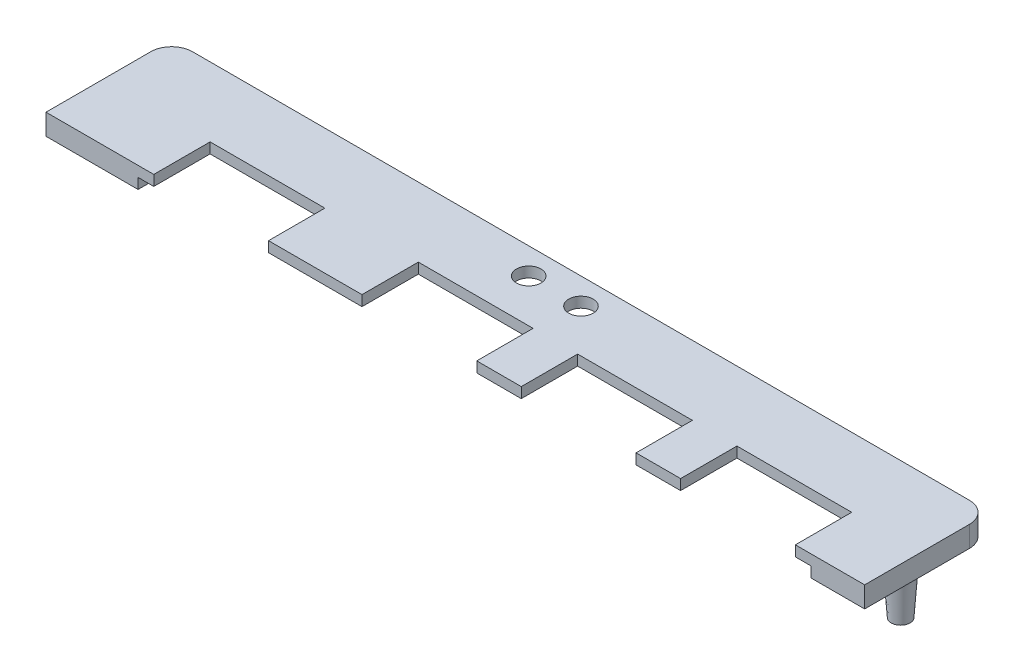
ISO-10303-21;
HEADER;
FILE_DESCRIPTION(('STEP AP214'),'2;1');
FILE_NAME('part.step','',(''),(''),'','','');
FILE_SCHEMA(('AUTOMOTIVE_DESIGN { 1 0 10303 214 1 1 1 1 }'));
ENDSEC;
DATA;
#1=APPLICATION_CONTEXT('core data for automotive mechanical design processes');
#2=APPLICATION_PROTOCOL_DEFINITION('international standard','automotive_design',2000,#1);
#3=PRODUCT_CONTEXT('',#1,'mechanical');
#4=PRODUCT('Part','Part','',(#3));
#5=PRODUCT_RELATED_PRODUCT_CATEGORY('part','',(#4));
#6=PRODUCT_DEFINITION_FORMATION('','',#4);
#7=PRODUCT_DEFINITION_CONTEXT('part definition',#1,'design');
#8=PRODUCT_DEFINITION('design','',#6,#7);
#9=PRODUCT_DEFINITION_SHAPE('','',#8);
#10=(LENGTH_UNIT() NAMED_UNIT(*) SI_UNIT(.MILLI.,.METRE.));
#11=(NAMED_UNIT(*) PLANE_ANGLE_UNIT() SI_UNIT($,.RADIAN.));
#12=(NAMED_UNIT(*) SI_UNIT($,.STERADIAN.) SOLID_ANGLE_UNIT());
#13=UNCERTAINTY_MEASURE_WITH_UNIT(LENGTH_MEASURE(1.E-05),#10,'distance_accuracy_value','');
#14=(GEOMETRIC_REPRESENTATION_CONTEXT(3) GLOBAL_UNCERTAINTY_ASSIGNED_CONTEXT((#13)) GLOBAL_UNIT_ASSIGNED_CONTEXT((#10,
#11,#12)) REPRESENTATION_CONTEXT('',''));
#15=CARTESIAN_POINT('',(0.,0.,0.));
#16=DIRECTION('',(0.,0.,1.));
#17=DIRECTION('',(1.,0.,0.));
#18=AXIS2_PLACEMENT_3D('',#15,#16,#17);
#19=CARTESIAN_POINT('',(0.,1.27,-26.3271000000001));
#20=DIRECTION('',(0.,0.,-1.));
#21=DIRECTION('',(-1.,0.,0.));
#22=AXIS2_PLACEMENT_3D('',#19,#20,#21);
#23=PLANE('',#22);
#24=DIRECTION('',(1.,0.,0.));
#25=VECTOR('',#24,1.);
#26=CARTESIAN_POINT('',(0.,0.,-26.3271000000001));
#27=LINE('',#26,#25);
#28=CARTESIAN_POINT('',(27.3685000000001,0.,-26.3271000000002));
#29=VERTEX_POINT('',#28);
#30=CARTESIAN_POINT('',(41.3131000000001,0.,-26.3271000000002));
#31=VERTEX_POINT('',#30);
#32=EDGE_CURVE('E354',#29,#31,#27,.T.);
#33=ORIENTED_EDGE('',*,*,#32,.T.);
#34=DIRECTION('',(0.,-1.,0.));
#35=VECTOR('',#34,1.);
#36=CARTESIAN_POINT('',(41.3131000000001,1.27,-26.3271000000002));
#37=LINE('',#36,#35);
#38=CARTESIAN_POINT('',(41.3131000000001,1.27,-26.3271000000002));
#39=VERTEX_POINT('',#38);
#40=EDGE_CURVE('E221',#39,#31,#37,.T.);
#41=ORIENTED_EDGE('',*,*,#40,.F.);
#42=DIRECTION('',(1.,0.,0.));
#43=VECTOR('',#42,1.);
#44=CARTESIAN_POINT('',(0.,1.27,-26.3271000000001));
#45=LINE('',#44,#43);
#46=CARTESIAN_POINT('',(27.3685000000001,1.27,-26.3271000000002));
#47=VERTEX_POINT('',#46);
#48=EDGE_CURVE('E317',#47,#39,#45,.T.);
#49=ORIENTED_EDGE('',*,*,#48,.F.);
#50=DIRECTION('',(0.,-1.,0.));
#51=VECTOR('',#50,1.);
#52=CARTESIAN_POINT('',(27.3685000000001,1.27,-26.3271000000002));
#53=LINE('',#52,#51);
#54=EDGE_CURVE('E362',#47,#29,#53,.T.);
#55=ORIENTED_EDGE('',*,*,#54,.T.);
#56=EDGE_LOOP('',(#33,#41,#49,#55));
#57=FACE_BOUND('',#56,.T.);
#58=ADVANCED_FACE('F36',(#57),#23,.F.);
#59=CARTESIAN_POINT('',(0.,1.27,-26.3271000000002));
#60=DIRECTION('',(0.,0.,-1.));
#61=DIRECTION('',(-1.,0.,0.));
#62=AXIS2_PLACEMENT_3D('',#59,#60,#61);
#63=PLANE('',#62);
#64=DIRECTION('',(1.,0.,0.));
#65=VECTOR('',#64,1.);
#66=CARTESIAN_POINT('',(0.,0.,-26.3271000000002));
#67=LINE('',#66,#65);
#68=CARTESIAN_POINT('',(8.01369999999999,0.,-26.3271000000002));
#69=VERTEX_POINT('',#68);
#70=CARTESIAN_POINT('',(21.9583,0.,-26.3271000000002));
#71=VERTEX_POINT('',#70);
#72=EDGE_CURVE('E345',#69,#71,#67,.T.);
#73=ORIENTED_EDGE('',*,*,#72,.T.);
#74=DIRECTION('',(0.,-1.,0.));
#75=VECTOR('',#74,1.);
#76=CARTESIAN_POINT('',(21.9583,1.27,-26.3271000000002));
#77=LINE('',#76,#75);
#78=CARTESIAN_POINT('',(21.9583,1.27,-26.3271000000002));
#79=VERTEX_POINT('',#78);
#80=EDGE_CURVE('E364',#79,#71,#77,.T.);
#81=ORIENTED_EDGE('',*,*,#80,.F.);
#82=DIRECTION('',(1.,0.,0.));
#83=VECTOR('',#82,1.);
#84=CARTESIAN_POINT('',(0.,1.27,-26.3271000000002));
#85=LINE('',#84,#83);
#86=CARTESIAN_POINT('',(8.01369999999999,1.27,-26.3271000000002));
#87=VERTEX_POINT('',#86);
#88=EDGE_CURVE('E308',#87,#79,#85,.T.);
#89=ORIENTED_EDGE('',*,*,#88,.F.);
#90=DIRECTION('',(0.,-1.,0.));
#91=VECTOR('',#90,1.);
#92=CARTESIAN_POINT('',(8.01369999999999,1.27,-26.3271000000002));
#93=LINE('',#92,#91);
#94=EDGE_CURVE('E367',#87,#69,#93,.T.);
#95=ORIENTED_EDGE('',*,*,#94,.T.);
#96=EDGE_LOOP('',(#73,#81,#89,#95));
#97=FACE_BOUND('',#96,.T.);
#98=ADVANCED_FACE('F543',(#97),#63,.F.);
#99=CARTESIAN_POINT('',(0.,1.27,-26.3271000000002));
#100=DIRECTION('',(0.,0.,-1.));
#101=DIRECTION('',(-1.,0.,0.));
#102=AXIS2_PLACEMENT_3D('',#99,#100,#101);
#103=PLANE('',#102);
#104=DIRECTION('',(1.,0.,0.));
#105=VECTOR('',#104,1.);
#106=CARTESIAN_POINT('',(0.,0.,-26.3271000000002));
#107=LINE('',#106,#105);
#108=CARTESIAN_POINT('',(-11.3411,0.,-26.3271000000002));
#109=VERTEX_POINT('',#108);
#110=CARTESIAN_POINT('',(2.6035,0.,-26.3271000000002));
#111=VERTEX_POINT('',#110);
#112=EDGE_CURVE('E336',#109,#111,#107,.T.);
#113=ORIENTED_EDGE('',*,*,#112,.T.);
#114=DIRECTION('',(0.,-1.,0.));
#115=VECTOR('',#114,1.);
#116=CARTESIAN_POINT('',(2.6035,1.27,-26.3271000000002));
#117=LINE('',#116,#115);
#118=CARTESIAN_POINT('',(2.6035,1.27,-26.3271000000002));
#119=VERTEX_POINT('',#118);
#120=EDGE_CURVE('E369',#119,#111,#117,.T.);
#121=ORIENTED_EDGE('',*,*,#120,.F.);
#122=DIRECTION('',(1.,0.,0.));
#123=VECTOR('',#122,1.);
#124=CARTESIAN_POINT('',(0.,1.27,-26.3271000000002));
#125=LINE('',#124,#123);
#126=CARTESIAN_POINT('',(-11.3411,1.27,-26.3271000000002));
#127=VERTEX_POINT('',#126);
#128=EDGE_CURVE('E299',#127,#119,#125,.T.);
#129=ORIENTED_EDGE('',*,*,#128,.F.);
#130=DIRECTION('',(0.,-1.,0.));
#131=VECTOR('',#130,1.);
#132=CARTESIAN_POINT('',(-11.3411,1.27,-26.3271000000002));
#133=LINE('',#132,#131);
#134=EDGE_CURVE('E372',#127,#109,#133,.T.);
#135=ORIENTED_EDGE('',*,*,#134,.T.);
#136=EDGE_LOOP('',(#113,#121,#129,#135));
#137=FACE_BOUND('',#136,.T.);
#138=ADVANCED_FACE('F548',(#137),#103,.F.);
#139=CARTESIAN_POINT('',(0.,1.27,-26.3271000000001));
#140=DIRECTION('',(0.,0.,-1.));
#141=DIRECTION('',(-1.,0.,0.));
#142=AXIS2_PLACEMENT_3D('',#139,#140,#141);
#143=PLANE('',#142);
#144=DIRECTION('',(1.,0.,0.));
#145=VECTOR('',#144,1.);
#146=CARTESIAN_POINT('',(0.,0.,-26.3271000000001));
#147=LINE('',#146,#145);
#148=CARTESIAN_POINT('',(-36.6395000000001,0.,-26.3271000000001));
#149=VERTEX_POINT('',#148);
#150=CARTESIAN_POINT('',(-22.6949000000001,0.,-26.3271000000001));
#151=VERTEX_POINT('',#150);
#152=EDGE_CURVE('E330',#149,#151,#147,.T.);
#153=ORIENTED_EDGE('',*,*,#152,.T.);
#154=DIRECTION('',(0.,-1.,0.));
#155=VECTOR('',#154,1.);
#156=CARTESIAN_POINT('',(-22.6949000000001,1.27,-26.3271000000001));
#157=LINE('',#156,#155);
#158=CARTESIAN_POINT('',(-22.6949000000001,1.27,-26.3271000000001));
#159=VERTEX_POINT('',#158);
#160=EDGE_CURVE('E326',#159,#151,#157,.T.);
#161=ORIENTED_EDGE('',*,*,#160,.F.);
#162=DIRECTION('',(1.,0.,0.));
#163=VECTOR('',#162,1.);
#164=CARTESIAN_POINT('',(0.,1.27,-26.3271000000001));
#165=LINE('',#164,#163);
#166=CARTESIAN_POINT('',(-36.6395000000001,1.27,-26.3271000000001));
#167=VERTEX_POINT('',#166);
#168=EDGE_CURVE('E289',#167,#159,#165,.T.);
#169=ORIENTED_EDGE('',*,*,#168,.F.);
#170=DIRECTION('',(0.,-1.,0.));
#171=VECTOR('',#170,1.);
#172=CARTESIAN_POINT('',(-36.6395000000001,1.27,-26.3271000000001));
#173=LINE('',#172,#171);
#174=EDGE_CURVE('E374',#167,#149,#173,.T.);
#175=ORIENTED_EDGE('',*,*,#174,.T.);
#176=EDGE_LOOP('',(#153,#161,#169,#175));
#177=FACE_BOUND('',#176,.T.);
#178=ADVANCED_FACE('F530',(#177),#143,.F.);
#179=CARTESIAN_POINT('',(0.,1.27,-34.7472));
#180=DIRECTION('',(0.,0.,-1.));
#181=DIRECTION('',(-1.,0.,0.));
#182=AXIS2_PLACEMENT_3D('',#179,#180,#181);
#183=PLANE('',#182);
#184=DIRECTION('',(1.,0.,0.));
#185=VECTOR('',#184,1.);
#186=CARTESIAN_POINT('',(-49.7332,-1.27,-34.7472));
#187=LINE('',#186,#185);
#188=CARTESIAN_POINT('',(-47.1932,-1.27,-34.7472));
#189=VERTEX_POINT('',#188);
#190=CARTESIAN_POINT('',(-38.5445,-1.27,-34.7472));
#191=VERTEX_POINT('',#190);
#192=EDGE_CURVE('E274',#189,#191,#187,.T.);
#193=ORIENTED_EDGE('',*,*,#192,.F.);
#194=DIRECTION('',(0.,-1.,0.));
#195=VECTOR('',#194,1.);
#196=CARTESIAN_POINT('',(-47.1932,1.27,-34.7472));
#197=LINE('',#196,#195);
#198=CARTESIAN_POINT('',(-47.1932,1.27,-34.7472));
#199=VERTEX_POINT('',#198);
#200=EDGE_CURVE('E388',#189,#199,#197,.F.);
#201=ORIENTED_EDGE('',*,*,#200,.T.);
#202=DIRECTION('',(1.,0.,0.));
#203=VECTOR('',#202,1.);
#204=CARTESIAN_POINT('',(0.,1.27,-34.7472));
#205=LINE('',#204,#203);
#206=CARTESIAN_POINT('',(47.1932000000001,1.27,-34.7472));
#207=VERTEX_POINT('',#206);
#208=EDGE_CURVE('E293',#199,#207,#205,.T.);
#209=ORIENTED_EDGE('',*,*,#208,.T.);
#210=DIRECTION('',(0.,-1.,0.));
#211=VECTOR('',#210,1.);
#212=CARTESIAN_POINT('',(47.1932000000001,-1.27,-34.7472));
#213=LINE('',#212,#211);
#214=CARTESIAN_POINT('',(47.1932000000001,-1.27,-34.7472));
#215=VERTEX_POINT('',#214);
#216=EDGE_CURVE('E385',#207,#215,#213,.T.);
#217=ORIENTED_EDGE('',*,*,#216,.T.);
#218=DIRECTION('',(1.,0.,0.));
#219=VECTOR('',#218,1.);
#220=CARTESIAN_POINT('',(43.2181,-1.27,-34.7472));
#221=LINE('',#220,#219);
#222=CARTESIAN_POINT('',(43.2181,-1.27,-34.7472));
#223=VERTEX_POINT('',#222);
#224=EDGE_CURVE('E212',#223,#215,#221,.T.);
#225=ORIENTED_EDGE('',*,*,#224,.F.);
#226=DIRECTION('',(0.,1.,0.));
#227=VECTOR('',#226,1.);
#228=CARTESIAN_POINT('',(43.2181,-1.27,-34.7472));
#229=LINE('',#228,#227);
#230=CARTESIAN_POINT('',(43.2181,0.,-34.7472));
#231=VERTEX_POINT('',#230);
#232=EDGE_CURVE('E211',#223,#231,#229,.T.);
#233=ORIENTED_EDGE('',*,*,#232,.T.);
#234=DIRECTION('',(1.,0.,0.));
#235=VECTOR('',#234,1.);
#236=CARTESIAN_POINT('',(0.,0.,-34.7472));
#237=LINE('',#236,#235);
#238=CARTESIAN_POINT('',(-38.5445,0.,-34.7472));
#239=VERTEX_POINT('',#238);
#240=EDGE_CURVE('E333',#239,#231,#237,.T.);
#241=ORIENTED_EDGE('',*,*,#240,.F.);
#242=DIRECTION('',(0.,1.,0.));
#243=VECTOR('',#242,1.);
#244=CARTESIAN_POINT('',(-38.5445,-1.27,-34.7472));
#245=LINE('',#244,#243);
#246=EDGE_CURVE('E279',#191,#239,#245,.T.);
#247=ORIENTED_EDGE('',*,*,#246,.F.);
#248=EDGE_LOOP('',(#193,#201,#209,#217,#225,#233,#241,#247));
#249=FACE_BOUND('',#248,.T.);
#250=ADVANCED_FACE('F412',(#249),#183,.T.);
#251=CARTESIAN_POINT('',(0.,1.27,0.));
#252=DIRECTION('',(0.,1.,0.));
#253=DIRECTION('',(0.,0.,1.));
#254=AXIS2_PLACEMENT_3D('',#251,#252,#253);
#255=PLANE('',#254);
#256=CARTESIAN_POINT('',(-3.175,1.27,-31.5722000000001));
#257=DIRECTION('',(0.,1.,0.));
#258=DIRECTION('',(0.,0.,1.));
#259=AXIS2_PLACEMENT_3D('',#256,#257,#258);
#260=CIRCLE('',#259,1.4859);
#261=CARTESIAN_POINT('',(-3.175,1.27,-30.0863000000001));
#262=VERTEX_POINT('',#261);
#263=EDGE_CURVE('E454',#262,#262,#260,.T.);
#264=ORIENTED_EDGE('',*,*,#263,.F.);
#265=EDGE_LOOP('',(#264));
#266=FACE_BOUND('',#265,.T.);
#267=CARTESIAN_POINT('',(3.175,1.27,-31.5722000000001));
#268=DIRECTION('',(0.,1.,0.));
#269=DIRECTION('',(0.,0.,1.));
#270=AXIS2_PLACEMENT_3D('',#267,#268,#269);
#271=CIRCLE('',#270,1.4859);
#272=CARTESIAN_POINT('',(3.175,1.27,-30.0863000000001));
#273=VERTEX_POINT('',#272);
#274=EDGE_CURVE('E448',#273,#273,#271,.T.);
#275=ORIENTED_EDGE('',*,*,#274,.F.);
#276=EDGE_LOOP('',(#275));
#277=FACE_BOUND('',#276,.T.);
#278=ORIENTED_EDGE('',*,*,#208,.F.);
#279=CARTESIAN_POINT('',(-47.1932,1.27,-32.2072));
#280=DIRECTION('',(0.,1.,0.));
#281=DIRECTION('',(0.,0.,1.));
#282=AXIS2_PLACEMENT_3D('',#279,#280,#281);
#283=CIRCLE('',#282,2.54);
#284=CARTESIAN_POINT('',(-49.7332,1.27,-32.2072));
#285=VERTEX_POINT('',#284);
#286=EDGE_CURVE('E392',#199,#285,#283,.T.);
#287=ORIENTED_EDGE('',*,*,#286,.T.);
#288=DIRECTION('',(0.,0.,-1.));
#289=VECTOR('',#288,1.);
#290=CARTESIAN_POINT('',(-49.7332,1.27,0.));
#291=LINE('',#290,#289);
#292=CARTESIAN_POINT('',(-49.7332,1.27,-19.4818000000001));
#293=VERTEX_POINT('',#292);
#294=EDGE_CURVE('E296',#293,#285,#291,.T.);
#295=ORIENTED_EDGE('',*,*,#294,.F.);
#296=DIRECTION('',(1.,0.,0.));
#297=VECTOR('',#296,1.);
#298=CARTESIAN_POINT('',(-49.7332,1.27,-19.4818000000001));
#299=LINE('',#298,#297);
#300=CARTESIAN_POINT('',(-36.6395000000001,1.27,-19.4818000000001));
#301=VERTEX_POINT('',#300);
#302=EDGE_CURVE('E230',#293,#301,#299,.T.);
#303=ORIENTED_EDGE('',*,*,#302,.T.);
#304=DIRECTION('',(0.,0.,-1.));
#305=VECTOR('',#304,1.);
#306=CARTESIAN_POINT('',(-36.6395000000001,1.27,0.));
#307=LINE('',#306,#305);
#308=EDGE_CURVE('E286',#301,#167,#307,.T.);
#309=ORIENTED_EDGE('',*,*,#308,.T.);
#310=ORIENTED_EDGE('',*,*,#168,.T.);
#311=DIRECTION('',(0.,0.,-1.));
#312=VECTOR('',#311,1.);
#313=CARTESIAN_POINT('',(-22.6949000000001,1.27,0.));
#314=LINE('',#313,#312);
#315=CARTESIAN_POINT('',(-22.6949000000001,1.27,-19.4818000000001));
#316=VERTEX_POINT('',#315);
#317=EDGE_CURVE('E284',#316,#159,#314,.T.);
#318=ORIENTED_EDGE('',*,*,#317,.F.);
#319=CARTESIAN_POINT('',(-11.3411,1.27,-19.4818000000001));
#320=VERTEX_POINT('',#319);
#321=EDGE_CURVE('E424',#316,#320,#299,.T.);
#322=ORIENTED_EDGE('',*,*,#321,.T.);
#323=DIRECTION('',(0.,0.,1.));
#324=VECTOR('',#323,1.);
#325=CARTESIAN_POINT('',(-11.3411,1.27,0.));
#326=LINE('',#325,#324);
#327=EDGE_CURVE('E305',#127,#320,#326,.T.);
#328=ORIENTED_EDGE('',*,*,#327,.F.);
#329=ORIENTED_EDGE('',*,*,#128,.T.);
#330=DIRECTION('',(0.,0.,1.));
#331=VECTOR('',#330,1.);
#332=CARTESIAN_POINT('',(2.6035,1.27,0.));
#333=LINE('',#332,#331);
#334=CARTESIAN_POINT('',(2.6035,1.27,-19.4818000000001));
#335=VERTEX_POINT('',#334);
#336=EDGE_CURVE('E302',#119,#335,#333,.T.);
#337=ORIENTED_EDGE('',*,*,#336,.T.);
#338=CARTESIAN_POINT('',(8.01370000000001,1.27,-19.4818000000001));
#339=VERTEX_POINT('',#338);
#340=EDGE_CURVE('E427',#335,#339,#299,.T.);
#341=ORIENTED_EDGE('',*,*,#340,.T.);
#342=DIRECTION('',(0.,0.,1.));
#343=VECTOR('',#342,1.);
#344=CARTESIAN_POINT('',(8.01370000000009,1.27,0.));
#345=LINE('',#344,#343);
#346=EDGE_CURVE('E314',#87,#339,#345,.T.);
#347=ORIENTED_EDGE('',*,*,#346,.F.);
#348=ORIENTED_EDGE('',*,*,#88,.T.);
#349=DIRECTION('',(0.,0.,1.));
#350=VECTOR('',#349,1.);
#351=CARTESIAN_POINT('',(21.9583,1.27,0.));
#352=LINE('',#351,#350);
#353=CARTESIAN_POINT('',(21.9583,1.27,-19.4818000000001));
#354=VERTEX_POINT('',#353);
#355=EDGE_CURVE('E311',#79,#354,#352,.T.);
#356=ORIENTED_EDGE('',*,*,#355,.T.);
#357=CARTESIAN_POINT('',(27.3685000000001,1.27,-19.4818000000001));
#358=VERTEX_POINT('',#357);
#359=EDGE_CURVE('E428',#354,#358,#299,.T.);
#360=ORIENTED_EDGE('',*,*,#359,.T.);
#361=DIRECTION('',(0.,0.,1.));
#362=VECTOR('',#361,1.);
#363=CARTESIAN_POINT('',(27.3685000000001,1.27,0.));
#364=LINE('',#363,#362);
#365=EDGE_CURVE('E323',#47,#358,#364,.T.);
#366=ORIENTED_EDGE('',*,*,#365,.F.);
#367=ORIENTED_EDGE('',*,*,#48,.T.);
#368=DIRECTION('',(0.,0.,1.));
#369=VECTOR('',#368,1.);
#370=CARTESIAN_POINT('',(41.3131,1.27,1.02787895580192E-13));
#371=LINE('',#370,#369);
#372=CARTESIAN_POINT('',(41.3131000000001,1.27,-19.4818000000001));
#373=VERTEX_POINT('',#372);
#374=EDGE_CURVE('E320',#39,#373,#371,.T.);
#375=ORIENTED_EDGE('',*,*,#374,.T.);
#376=CARTESIAN_POINT('',(49.7332000000001,1.27,-19.4818000000001));
#377=VERTEX_POINT('',#376);
#378=EDGE_CURVE('E425',#373,#377,#299,.T.);
#379=ORIENTED_EDGE('',*,*,#378,.T.);
#380=DIRECTION('',(0.,0.,-1.));
#381=VECTOR('',#380,1.);
#382=CARTESIAN_POINT('',(49.7332000000001,1.27,0.));
#383=LINE('',#382,#381);
#384=CARTESIAN_POINT('',(49.7332000000001,1.27,-32.2072));
#385=VERTEX_POINT('',#384);
#386=EDGE_CURVE('E224',#377,#385,#383,.T.);
#387=ORIENTED_EDGE('',*,*,#386,.T.);
#388=CARTESIAN_POINT('',(47.1932000000001,1.27,-32.2072));
#389=DIRECTION('',(0.,1.,0.));
#390=DIRECTION('',(0.,0.,1.));
#391=AXIS2_PLACEMENT_3D('',#388,#389,#390);
#392=CIRCLE('',#391,2.54);
#393=EDGE_CURVE('E390',#385,#207,#392,.T.);
#394=ORIENTED_EDGE('',*,*,#393,.T.);
#395=EDGE_LOOP('',(#278,#287,#295,#303,#309,#310,#318,#322,#328,#329,#337,#341,#347,#348,#356,
#360,#366,#367,#375,#379,#387,#394));
#396=FACE_BOUND('',#395,.T.);
#397=ADVANCED_FACE('F397',(#266,#277,#396),#255,.T.);
#398=CARTESIAN_POINT('',(0.,-1.27,0.));
#399=DIRECTION('',(0.,-1.,0.));
#400=DIRECTION('',(0.,0.,-1.));
#401=AXIS2_PLACEMENT_3D('',#398,#399,#400);
#402=PLANE('',#401);
#403=CARTESIAN_POINT('',(-46.4756500000001,-1.27,-27.1145000000001));
#404=DIRECTION('',(0.,-1.,0.));
#405=DIRECTION('',(0.,0.,1.));
#406=AXIS2_PLACEMENT_3D('',#403,#404,#405);
#407=CIRCLE('',#406,1.5875);
#408=CARTESIAN_POINT('',(-46.4756500000001,-1.27,-25.5270000000001));
#409=VERTEX_POINT('',#408);
#410=EDGE_CURVE('E432',#409,#409,#407,.T.);
#411=ORIENTED_EDGE('',*,*,#410,.F.);
#412=EDGE_LOOP('',(#411));
#413=FACE_BOUND('',#412,.T.);
#414=DIRECTION('',(0.,0.,-1.));
#415=VECTOR('',#414,1.);
#416=CARTESIAN_POINT('',(-49.7332,-1.27,34.7472));
#417=LINE('',#416,#415);
#418=CARTESIAN_POINT('',(-49.7332,-1.27,-19.4818000000001));
#419=VERTEX_POINT('',#418);
#420=CARTESIAN_POINT('',(-49.7332,-1.27,-32.2072));
#421=VERTEX_POINT('',#420);
#422=EDGE_CURVE('E271',#419,#421,#417,.T.);
#423=ORIENTED_EDGE('',*,*,#422,.T.);
#424=CARTESIAN_POINT('',(-47.1932,-1.27,-32.2072));
#425=DIRECTION('',(0.,-1.,0.));
#426=DIRECTION('',(0.,0.,-1.));
#427=AXIS2_PLACEMENT_3D('',#424,#425,#426);
#428=CIRCLE('',#427,2.54);
#429=EDGE_CURVE('E383',#421,#189,#428,.T.);
#430=ORIENTED_EDGE('',*,*,#429,.T.);
#431=ORIENTED_EDGE('',*,*,#192,.T.);
#432=DIRECTION('',(0.,0.,1.));
#433=VECTOR('',#432,1.);
#434=CARTESIAN_POINT('',(-38.5445000000001,-1.27,34.7472));
#435=LINE('',#434,#433);
#436=CARTESIAN_POINT('',(-38.5445,-1.27,-19.4818000000001));
#437=VERTEX_POINT('',#436);
#438=EDGE_CURVE('E276',#191,#437,#435,.T.);
#439=ORIENTED_EDGE('',*,*,#438,.T.);
#440=DIRECTION('',(1.,0.,0.));
#441=VECTOR('',#440,1.);
#442=CARTESIAN_POINT('',(-49.7332,-1.27,-19.4818000000001));
#443=LINE('',#442,#441);
#444=EDGE_CURVE('E226',#419,#437,#443,.T.);
#445=ORIENTED_EDGE('',*,*,#444,.F.);
#446=EDGE_LOOP('',(#423,#430,#431,#439,#445));
#447=FACE_BOUND('',#446,.T.);
#448=ADVANCED_FACE('F408',(#413,#447),#402,.T.);
#449=CARTESIAN_POINT('',(-38.5445000000001,-1.27,34.7472));
#450=DIRECTION('',(-1.,0.,0.));
#451=DIRECTION('',(0.,0.,1.));
#452=AXIS2_PLACEMENT_3D('',#449,#450,#451);
#453=PLANE('',#452);
#454=DIRECTION('',(0.,1.,0.));
#455=VECTOR('',#454,1.);
#456=CARTESIAN_POINT('',(-38.5445,-1.27,-19.4818000000001));
#457=LINE('',#456,#455);
#458=CARTESIAN_POINT('',(-38.5445,0.,-19.4818000000001));
#459=VERTEX_POINT('',#458);
#460=EDGE_CURVE('E241',#437,#459,#457,.T.);
#461=ORIENTED_EDGE('',*,*,#460,.F.);
#462=ORIENTED_EDGE('',*,*,#438,.F.);
#463=ORIENTED_EDGE('',*,*,#246,.T.);
#464=DIRECTION('',(0.,0.,1.));
#465=VECTOR('',#464,1.);
#466=CARTESIAN_POINT('',(-38.5445000000001,0.,34.7472));
#467=LINE('',#466,#465);
#468=EDGE_CURVE('E270',#239,#459,#467,.T.);
#469=ORIENTED_EDGE('',*,*,#468,.T.);
#470=EDGE_LOOP('',(#461,#462,#463,#469));
#471=FACE_BOUND('',#470,.T.);
#472=ADVANCED_FACE('F418',(#471),#453,.F.);
#473=CARTESIAN_POINT('',(-49.7332,1.27,0.));
#474=DIRECTION('',(-1.,0.,0.));
#475=DIRECTION('',(0.,0.,1.));
#476=AXIS2_PLACEMENT_3D('',#473,#474,#475);
#477=PLANE('',#476);
#478=ORIENTED_EDGE('',*,*,#294,.T.);
#479=DIRECTION('',(0.,-1.,0.));
#480=VECTOR('',#479,1.);
#481=CARTESIAN_POINT('',(-49.7332,1.27,-32.2072));
#482=LINE('',#481,#480);
#483=EDGE_CURVE('E220',#285,#421,#482,.T.);
#484=ORIENTED_EDGE('',*,*,#483,.T.);
#485=ORIENTED_EDGE('',*,*,#422,.F.);
#486=DIRECTION('',(0.,1.,0.));
#487=VECTOR('',#486,1.);
#488=CARTESIAN_POINT('',(-49.7332,-1.27,-19.4818000000001));
#489=LINE('',#488,#487);
#490=EDGE_CURVE('E225',#419,#293,#489,.T.);
#491=ORIENTED_EDGE('',*,*,#490,.T.);
#492=EDGE_LOOP('',(#478,#484,#485,#491));
#493=FACE_BOUND('',#492,.T.);
#494=ADVANCED_FACE('F403',(#493),#477,.T.);
#495=CARTESIAN_POINT('',(-11.3411,1.27,0.));
#496=DIRECTION('',(1.,0.,0.));
#497=DIRECTION('',(0.,0.,-1.));
#498=AXIS2_PLACEMENT_3D('',#495,#496,#497);
#499=PLANE('',#498);
#500=ORIENTED_EDGE('',*,*,#327,.T.);
#501=DIRECTION('',(0.,-1.,0.));
#502=VECTOR('',#501,1.);
#503=CARTESIAN_POINT('',(-11.3411,1.27,-19.4818000000001));
#504=LINE('',#503,#502);
#505=CARTESIAN_POINT('',(-11.3411,0.,-19.4818000000001));
#506=VERTEX_POINT('',#505);
#507=EDGE_CURVE('E245',#320,#506,#504,.T.);
#508=ORIENTED_EDGE('',*,*,#507,.T.);
#509=DIRECTION('',(0.,0.,1.));
#510=VECTOR('',#509,1.);
#511=CARTESIAN_POINT('',(-11.3411,0.,0.));
#512=LINE('',#511,#510);
#513=EDGE_CURVE('E342',#109,#506,#512,.T.);
#514=ORIENTED_EDGE('',*,*,#513,.F.);
#515=ORIENTED_EDGE('',*,*,#134,.F.);
#516=EDGE_LOOP('',(#500,#508,#514,#515));
#517=FACE_BOUND('',#516,.T.);
#518=ADVANCED_FACE('F520',(#517),#499,.T.);
#519=CARTESIAN_POINT('',(8.01370000000009,1.27,0.));
#520=DIRECTION('',(1.,0.,0.));
#521=DIRECTION('',(0.,0.,-1.));
#522=AXIS2_PLACEMENT_3D('',#519,#520,#521);
#523=PLANE('',#522);
#524=ORIENTED_EDGE('',*,*,#346,.T.);
#525=DIRECTION('',(0.,-1.,0.));
#526=VECTOR('',#525,1.);
#527=CARTESIAN_POINT('',(8.01370000000001,1.27,-19.4818000000001));
#528=LINE('',#527,#526);
#529=CARTESIAN_POINT('',(8.01370000000001,0.,-19.4818000000001));
#530=VERTEX_POINT('',#529);
#531=EDGE_CURVE('E252',#339,#530,#528,.T.);
#532=ORIENTED_EDGE('',*,*,#531,.T.);
#533=DIRECTION('',(0.,0.,1.));
#534=VECTOR('',#533,1.);
#535=CARTESIAN_POINT('',(8.01370000000009,0.,0.));
#536=LINE('',#535,#534);
#537=EDGE_CURVE('E351',#69,#530,#536,.T.);
#538=ORIENTED_EDGE('',*,*,#537,.F.);
#539=ORIENTED_EDGE('',*,*,#94,.F.);
#540=EDGE_LOOP('',(#524,#532,#538,#539));
#541=FACE_BOUND('',#540,.T.);
#542=ADVANCED_FACE('F505',(#541),#523,.T.);
#543=CARTESIAN_POINT('',(27.3685000000001,1.27,0.));
#544=DIRECTION('',(1.,0.,0.));
#545=DIRECTION('',(0.,0.,-1.));
#546=AXIS2_PLACEMENT_3D('',#543,#544,#545);
#547=PLANE('',#546);
#548=ORIENTED_EDGE('',*,*,#365,.T.);
#549=DIRECTION('',(0.,-1.,0.));
#550=VECTOR('',#549,1.);
#551=CARTESIAN_POINT('',(27.3685000000001,1.27,-19.4818000000001));
#552=LINE('',#551,#550);
#553=CARTESIAN_POINT('',(27.3685000000001,0.,-19.4818000000001));
#554=VERTEX_POINT('',#553);
#555=EDGE_CURVE('E258',#358,#554,#552,.T.);
#556=ORIENTED_EDGE('',*,*,#555,.T.);
#557=DIRECTION('',(0.,0.,1.));
#558=VECTOR('',#557,1.);
#559=CARTESIAN_POINT('',(27.3685000000001,0.,0.));
#560=LINE('',#559,#558);
#561=EDGE_CURVE('E287',#29,#554,#560,.T.);
#562=ORIENTED_EDGE('',*,*,#561,.F.);
#563=ORIENTED_EDGE('',*,*,#54,.F.);
#564=EDGE_LOOP('',(#548,#556,#562,#563));
#565=FACE_BOUND('',#564,.T.);
#566=ADVANCED_FACE('F491',(#565),#547,.T.);
#567=CARTESIAN_POINT('',(-36.6395000000001,1.27,0.));
#568=DIRECTION('',(-1.,0.,0.));
#569=DIRECTION('',(0.,0.,1.));
#570=AXIS2_PLACEMENT_3D('',#567,#568,#569);
#571=PLANE('',#570);
#572=DIRECTION('',(0.,1.,0.));
#573=VECTOR('',#572,1.);
#574=CARTESIAN_POINT('',(-36.6395000000001,1.27,-19.4818000000001));
#575=LINE('',#574,#573);
#576=CARTESIAN_POINT('',(-36.6395000000001,0.,-19.4818000000001));
#577=VERTEX_POINT('',#576);
#578=EDGE_CURVE('E243',#577,#301,#575,.T.);
#579=ORIENTED_EDGE('',*,*,#578,.F.);
#580=DIRECTION('',(0.,0.,-1.));
#581=VECTOR('',#580,1.);
#582=CARTESIAN_POINT('',(-36.6395000000001,0.,0.));
#583=LINE('',#582,#581);
#584=EDGE_CURVE('E328',#577,#149,#583,.T.);
#585=ORIENTED_EDGE('',*,*,#584,.T.);
#586=ORIENTED_EDGE('',*,*,#174,.F.);
#587=ORIENTED_EDGE('',*,*,#308,.F.);
#588=EDGE_LOOP('',(#579,#585,#586,#587));
#589=FACE_BOUND('',#588,.T.);
#590=ADVANCED_FACE('F532',(#589),#571,.F.);
#591=CARTESIAN_POINT('',(-22.6949000000001,1.27,0.));
#592=DIRECTION('',(-1.,0.,0.));
#593=DIRECTION('',(0.,0.,1.));
#594=AXIS2_PLACEMENT_3D('',#591,#592,#593);
#595=PLANE('',#594);
#596=DIRECTION('',(0.,0.,-1.));
#597=VECTOR('',#596,1.);
#598=CARTESIAN_POINT('',(-22.6949000000001,0.,0.));
#599=LINE('',#598,#597);
#600=CARTESIAN_POINT('',(-22.6949000000001,0.,-19.4818000000001));
#601=VERTEX_POINT('',#600);
#602=EDGE_CURVE('E283',#601,#151,#599,.T.);
#603=ORIENTED_EDGE('',*,*,#602,.F.);
#604=DIRECTION('',(0.,1.,0.));
#605=VECTOR('',#604,1.);
#606=CARTESIAN_POINT('',(-22.6949000000001,1.27,-19.4818000000001));
#607=LINE('',#606,#605);
#608=EDGE_CURVE('E249',#601,#316,#607,.T.);
#609=ORIENTED_EDGE('',*,*,#608,.T.);
#610=ORIENTED_EDGE('',*,*,#317,.T.);
#611=ORIENTED_EDGE('',*,*,#160,.T.);
#612=EDGE_LOOP('',(#603,#609,#610,#611));
#613=FACE_BOUND('',#612,.T.);
#614=ADVANCED_FACE('F527',(#613),#595,.T.);
#615=CARTESIAN_POINT('',(0.,-1.27,0.));
#616=DIRECTION('',(0.,-1.,0.));
#617=DIRECTION('',(0.,0.,-1.));
#618=AXIS2_PLACEMENT_3D('',#615,#616,#617);
#619=PLANE('',#618);
#620=CARTESIAN_POINT('',(46.4756500000001,-1.27,-27.1145000000001));
#621=DIRECTION('',(0.,-1.,0.));
#622=DIRECTION('',(0.,0.,-1.));
#623=AXIS2_PLACEMENT_3D('',#620,#621,#622);
#624=CIRCLE('',#623,1.5875);
#625=CARTESIAN_POINT('',(46.4756500000001,-1.27,-28.7020000000001));
#626=VERTEX_POINT('',#625);
#627=EDGE_CURVE('E442',#626,#626,#624,.T.);
#628=ORIENTED_EDGE('',*,*,#627,.F.);
#629=EDGE_LOOP('',(#628));
#630=FACE_BOUND('',#629,.T.);
#631=ORIENTED_EDGE('',*,*,#224,.T.);
#632=CARTESIAN_POINT('',(47.1932000000001,-1.27,-32.2072));
#633=DIRECTION('',(0.,-1.,0.));
#634=DIRECTION('',(0.,0.,-1.));
#635=AXIS2_PLACEMENT_3D('',#632,#633,#634);
#636=CIRCLE('',#635,2.54);
#637=CARTESIAN_POINT('',(49.7332000000001,-1.27,-32.2072));
#638=VERTEX_POINT('',#637);
#639=EDGE_CURVE('E44',#215,#638,#636,.T.);
#640=ORIENTED_EDGE('',*,*,#639,.T.);
#641=DIRECTION('',(0.,0.,1.));
#642=VECTOR('',#641,1.);
#643=CARTESIAN_POINT('',(49.7332,-1.27,34.7472));
#644=LINE('',#643,#642);
#645=CARTESIAN_POINT('',(49.7332000000001,-1.27,-19.4818000000001));
#646=VERTEX_POINT('',#645);
#647=EDGE_CURVE('E205',#638,#646,#644,.T.);
#648=ORIENTED_EDGE('',*,*,#647,.T.);
#649=DIRECTION('',(-1.,0.,0.));
#650=VECTOR('',#649,1.);
#651=CARTESIAN_POINT('',(0.,-1.27,-19.4818000000001));
#652=LINE('',#651,#650);
#653=CARTESIAN_POINT('',(43.2181,-1.27,-19.4818000000001));
#654=VERTEX_POINT('',#653);
#655=EDGE_CURVE('E208',#646,#654,#652,.T.);
#656=ORIENTED_EDGE('',*,*,#655,.T.);
#657=DIRECTION('',(0.,0.,-1.));
#658=VECTOR('',#657,1.);
#659=CARTESIAN_POINT('',(43.2181,-1.27,34.7472));
#660=LINE('',#659,#658);
#661=EDGE_CURVE('E264',#654,#223,#660,.T.);
#662=ORIENTED_EDGE('',*,*,#661,.T.);
#663=EDGE_LOOP('',(#631,#640,#648,#656,#662));
#664=FACE_BOUND('',#663,.T.);
#665=ADVANCED_FACE('F207',(#630,#664),#619,.T.);
#666=CARTESIAN_POINT('',(43.2181,-1.27,34.7472));
#667=DIRECTION('',(1.,0.,0.));
#668=DIRECTION('',(0.,0.,-1.));
#669=AXIS2_PLACEMENT_3D('',#666,#667,#668);
#670=PLANE('',#669);
#671=DIRECTION('',(0.,-1.,0.));
#672=VECTOR('',#671,1.);
#673=CARTESIAN_POINT('',(43.2181,-1.27,-19.4818000000001));
#674=LINE('',#673,#672);
#675=CARTESIAN_POINT('',(43.2181,0.,-19.4818000000001));
#676=VERTEX_POINT('',#675);
#677=EDGE_CURVE('E219',#676,#654,#674,.T.);
#678=ORIENTED_EDGE('',*,*,#677,.F.);
#679=DIRECTION('',(0.,0.,-1.));
#680=VECTOR('',#679,1.);
#681=CARTESIAN_POINT('',(43.2181,0.,34.7472));
#682=LINE('',#681,#680);
#683=EDGE_CURVE('E263',#676,#231,#682,.T.);
#684=ORIENTED_EDGE('',*,*,#683,.T.);
#685=ORIENTED_EDGE('',*,*,#232,.F.);
#686=ORIENTED_EDGE('',*,*,#661,.F.);
#687=EDGE_LOOP('',(#678,#684,#685,#686));
#688=FACE_BOUND('',#687,.T.);
#689=ADVANCED_FACE('F567',(#688),#670,.F.);
#690=CARTESIAN_POINT('',(49.7332000000001,1.27,0.));
#691=DIRECTION('',(-1.,0.,0.));
#692=DIRECTION('',(0.,0.,1.));
#693=AXIS2_PLACEMENT_3D('',#690,#691,#692);
#694=PLANE('',#693);
#695=ORIENTED_EDGE('',*,*,#647,.F.);
#696=DIRECTION('',(0.,-1.,0.));
#697=VECTOR('',#696,1.);
#698=CARTESIAN_POINT('',(49.7332000000001,1.27,-32.2072));
#699=LINE('',#698,#697);
#700=EDGE_CURVE('E11',#638,#385,#699,.F.);
#701=ORIENTED_EDGE('',*,*,#700,.T.);
#702=ORIENTED_EDGE('',*,*,#386,.F.);
#703=DIRECTION('',(0.,1.,0.));
#704=VECTOR('',#703,1.);
#705=CARTESIAN_POINT('',(49.7332000000001,-1.27,-19.4818000000001));
#706=LINE('',#705,#704);
#707=EDGE_CURVE('E216',#646,#377,#706,.T.);
#708=ORIENTED_EDGE('',*,*,#707,.F.);
#709=EDGE_LOOP('',(#695,#701,#702,#708));
#710=FACE_BOUND('',#709,.T.);
#711=ADVANCED_FACE('F223',(#710),#694,.F.);
#712=CARTESIAN_POINT('',(2.6035,1.27,0.));
#713=DIRECTION('',(1.,0.,0.));
#714=DIRECTION('',(0.,0.,-1.));
#715=AXIS2_PLACEMENT_3D('',#712,#713,#714);
#716=PLANE('',#715);
#717=DIRECTION('',(0.,-1.,0.));
#718=VECTOR('',#717,1.);
#719=CARTESIAN_POINT('',(2.6035,1.27,-19.4818000000001));
#720=LINE('',#719,#718);
#721=CARTESIAN_POINT('',(2.6035,0.,-19.4818000000001));
#722=VERTEX_POINT('',#721);
#723=EDGE_CURVE('E256',#335,#722,#720,.T.);
#724=ORIENTED_EDGE('',*,*,#723,.F.);
#725=ORIENTED_EDGE('',*,*,#336,.F.);
#726=ORIENTED_EDGE('',*,*,#120,.T.);
#727=DIRECTION('',(0.,0.,1.));
#728=VECTOR('',#727,1.);
#729=CARTESIAN_POINT('',(2.6035,0.,0.));
#730=LINE('',#729,#728);
#731=EDGE_CURVE('E339',#111,#722,#730,.T.);
#732=ORIENTED_EDGE('',*,*,#731,.T.);
#733=EDGE_LOOP('',(#724,#725,#726,#732));
#734=FACE_BOUND('',#733,.T.);
#735=ADVANCED_FACE('F515',(#734),#716,.F.);
#736=CARTESIAN_POINT('',(21.9583,1.27,0.));
#737=DIRECTION('',(1.,0.,0.));
#738=DIRECTION('',(0.,0.,-1.));
#739=AXIS2_PLACEMENT_3D('',#736,#737,#738);
#740=PLANE('',#739);
#741=DIRECTION('',(0.,-1.,0.));
#742=VECTOR('',#741,1.);
#743=CARTESIAN_POINT('',(21.9583,1.27,-19.4818000000001));
#744=LINE('',#743,#742);
#745=CARTESIAN_POINT('',(21.9583,0.,-19.4818000000001));
#746=VERTEX_POINT('',#745);
#747=EDGE_CURVE('E261',#354,#746,#744,.T.);
#748=ORIENTED_EDGE('',*,*,#747,.F.);
#749=ORIENTED_EDGE('',*,*,#355,.F.);
#750=ORIENTED_EDGE('',*,*,#80,.T.);
#751=DIRECTION('',(0.,0.,1.));
#752=VECTOR('',#751,1.);
#753=CARTESIAN_POINT('',(21.9583,0.,0.));
#754=LINE('',#753,#752);
#755=EDGE_CURVE('E348',#71,#746,#754,.T.);
#756=ORIENTED_EDGE('',*,*,#755,.T.);
#757=EDGE_LOOP('',(#748,#749,#750,#756));
#758=FACE_BOUND('',#757,.T.);
#759=ADVANCED_FACE('F499',(#758),#740,.F.);
#760=CARTESIAN_POINT('',(41.3131,1.27,1.02787895580192E-13));
#761=DIRECTION('',(1.,0.,0.));
#762=DIRECTION('',(0.,0.,-1.));
#763=AXIS2_PLACEMENT_3D('',#760,#761,#762);
#764=PLANE('',#763);
#765=DIRECTION('',(0.,-1.,0.));
#766=VECTOR('',#765,1.);
#767=CARTESIAN_POINT('',(41.3131000000001,1.27,-19.4818000000001));
#768=LINE('',#767,#766);
#769=CARTESIAN_POINT('',(41.3131000000001,0.,-19.4818000000001));
#770=VERTEX_POINT('',#769);
#771=EDGE_CURVE('E237',#373,#770,#768,.T.);
#772=ORIENTED_EDGE('',*,*,#771,.F.);
#773=ORIENTED_EDGE('',*,*,#374,.F.);
#774=ORIENTED_EDGE('',*,*,#40,.T.);
#775=DIRECTION('',(0.,0.,1.));
#776=VECTOR('',#775,1.);
#777=CARTESIAN_POINT('',(41.3131,0.,1.02787895580192E-13));
#778=LINE('',#777,#776);
#779=EDGE_CURVE('E357',#31,#770,#778,.T.);
#780=ORIENTED_EDGE('',*,*,#779,.T.);
#781=EDGE_LOOP('',(#772,#773,#774,#780));
#782=FACE_BOUND('',#781,.T.);
#783=ADVANCED_FACE('F476',(#782),#764,.F.);
#784=CARTESIAN_POINT('',(0.,0.,0.));
#785=DIRECTION('',(0.,1.,0.));
#786=DIRECTION('',(0.,0.,1.));
#787=AXIS2_PLACEMENT_3D('',#784,#785,#786);
#788=PLANE('',#787);
#789=CARTESIAN_POINT('',(-3.175,0.,-31.5722000000001));
#790=DIRECTION('',(0.,1.,0.));
#791=DIRECTION('',(0.,0.,1.));
#792=AXIS2_PLACEMENT_3D('',#789,#790,#791);
#793=CIRCLE('',#792,1.4859);
#794=CARTESIAN_POINT('',(-3.175,0.,-30.0863000000001));
#795=VERTEX_POINT('',#794);
#796=EDGE_CURVE('E451',#795,#795,#793,.F.);
#797=ORIENTED_EDGE('',*,*,#796,.F.);
#798=EDGE_LOOP('',(#797));
#799=FACE_BOUND('',#798,.T.);
#800=CARTESIAN_POINT('',(3.175,0.,-31.5722000000001));
#801=DIRECTION('',(0.,1.,0.));
#802=DIRECTION('',(0.,0.,1.));
#803=AXIS2_PLACEMENT_3D('',#800,#801,#802);
#804=CIRCLE('',#803,1.4859);
#805=CARTESIAN_POINT('',(3.175,0.,-30.0863000000001));
#806=VERTEX_POINT('',#805);
#807=EDGE_CURVE('E445',#806,#806,#804,.F.);
#808=ORIENTED_EDGE('',*,*,#807,.F.);
#809=EDGE_LOOP('',(#808));
#810=FACE_BOUND('',#809,.T.);
#811=DIRECTION('',(1.,0.,0.));
#812=VECTOR('',#811,1.);
#813=CARTESIAN_POINT('',(0.,0.,-19.4818000000001));
#814=LINE('',#813,#812);
#815=EDGE_CURVE('E239',#459,#577,#814,.T.);
#816=ORIENTED_EDGE('',*,*,#815,.F.);
#817=ORIENTED_EDGE('',*,*,#468,.F.);
#818=ORIENTED_EDGE('',*,*,#240,.T.);
#819=ORIENTED_EDGE('',*,*,#683,.F.);
#820=EDGE_CURVE('E235',#770,#676,#814,.T.);
#821=ORIENTED_EDGE('',*,*,#820,.F.);
#822=ORIENTED_EDGE('',*,*,#779,.F.);
#823=ORIENTED_EDGE('',*,*,#32,.F.);
#824=ORIENTED_EDGE('',*,*,#561,.T.);
#825=EDGE_CURVE('E238',#746,#554,#814,.T.);
#826=ORIENTED_EDGE('',*,*,#825,.F.);
#827=ORIENTED_EDGE('',*,*,#755,.F.);
#828=ORIENTED_EDGE('',*,*,#72,.F.);
#829=ORIENTED_EDGE('',*,*,#537,.T.);
#830=EDGE_CURVE('E255',#722,#530,#814,.T.);
#831=ORIENTED_EDGE('',*,*,#830,.F.);
#832=ORIENTED_EDGE('',*,*,#731,.F.);
#833=ORIENTED_EDGE('',*,*,#112,.F.);
#834=ORIENTED_EDGE('',*,*,#513,.T.);
#835=EDGE_CURVE('E248',#601,#506,#814,.T.);
#836=ORIENTED_EDGE('',*,*,#835,.F.);
#837=ORIENTED_EDGE('',*,*,#602,.T.);
#838=ORIENTED_EDGE('',*,*,#152,.F.);
#839=ORIENTED_EDGE('',*,*,#584,.F.);
#840=EDGE_LOOP('',(#816,#817,#818,#819,#821,#822,#823,#824,#826,#827,#828,#829,#831,#832,#833,
#834,#836,#837,#838,#839));
#841=FACE_BOUND('',#840,.T.);
#842=ADVANCED_FACE('F473',(#799,#810,#841),#788,.F.);
#843=CARTESIAN_POINT('',(-49.7332,-1.27,-19.4818000000001));
#844=DIRECTION('',(0.,0.,1.));
#845=DIRECTION('',(1.,0.,0.));
#846=AXIS2_PLACEMENT_3D('',#843,#844,#845);
#847=PLANE('',#846);
#848=ORIENTED_EDGE('',*,*,#771,.T.);
#849=ORIENTED_EDGE('',*,*,#820,.T.);
#850=ORIENTED_EDGE('',*,*,#677,.T.);
#851=ORIENTED_EDGE('',*,*,#655,.F.);
#852=ORIENTED_EDGE('',*,*,#707,.T.);
#853=ORIENTED_EDGE('',*,*,#378,.F.);
#854=EDGE_LOOP('',(#848,#849,#850,#851,#852,#853));
#855=FACE_BOUND('',#854,.T.);
#856=ADVANCED_FACE('F215',(#855),#847,.T.);
#857=ORIENTED_EDGE('',*,*,#578,.T.);
#858=ORIENTED_EDGE('',*,*,#302,.F.);
#859=ORIENTED_EDGE('',*,*,#490,.F.);
#860=ORIENTED_EDGE('',*,*,#444,.T.);
#861=ORIENTED_EDGE('',*,*,#460,.T.);
#862=ORIENTED_EDGE('',*,*,#815,.T.);
#863=EDGE_LOOP('',(#857,#858,#859,#860,#861,#862));
#864=FACE_BOUND('',#863,.T.);
#865=ADVANCED_FACE('F420',(#864),#847,.T.);
#866=ORIENTED_EDGE('',*,*,#747,.T.);
#867=ORIENTED_EDGE('',*,*,#825,.T.);
#868=ORIENTED_EDGE('',*,*,#555,.F.);
#869=ORIENTED_EDGE('',*,*,#359,.F.);
#870=EDGE_LOOP('',(#866,#867,#868,#869));
#871=FACE_BOUND('',#870,.T.);
#872=ADVANCED_FACE('F487',(#871),#847,.T.);
#873=ORIENTED_EDGE('',*,*,#723,.T.);
#874=ORIENTED_EDGE('',*,*,#830,.T.);
#875=ORIENTED_EDGE('',*,*,#531,.F.);
#876=ORIENTED_EDGE('',*,*,#340,.F.);
#877=EDGE_LOOP('',(#873,#874,#875,#876));
#878=FACE_BOUND('',#877,.T.);
#879=ADVANCED_FACE('F509',(#878),#847,.T.);
#880=ORIENTED_EDGE('',*,*,#835,.T.);
#881=ORIENTED_EDGE('',*,*,#507,.F.);
#882=ORIENTED_EDGE('',*,*,#321,.F.);
#883=ORIENTED_EDGE('',*,*,#608,.F.);
#884=EDGE_LOOP('',(#880,#881,#882,#883));
#885=FACE_BOUND('',#884,.T.);
#886=ADVANCED_FACE('F521',(#885),#847,.T.);
#887=CARTESIAN_POINT('',(-46.4756500000001,-1.27,-27.1145000000001));
#888=DIRECTION('',(0.,1.,0.));
#889=DIRECTION('',(0.,0.,1.));
#890=AXIS2_PLACEMENT_3D('',#887,#888,#889);
#891=CONICAL_SURFACE('',#890,1.5875,0.0698131700797732);
#892=CARTESIAN_POINT('',(-46.4756500000001,-7.62,-27.1145000000001));
#893=DIRECTION('',(0.,1.,0.));
#894=DIRECTION('',(0.,0.,1.));
#895=AXIS2_PLACEMENT_3D('',#892,#893,#894);
#896=CIRCLE('',#895,1.14346474415871);
#897=CARTESIAN_POINT('',(-46.4756500000001,-7.62,-25.9710352558414));
#898=VERTEX_POINT('',#897);
#899=EDGE_CURVE('E429',#898,#898,#896,.F.);
#900=ORIENTED_EDGE('',*,*,#899,.F.);
#901=EDGE_LOOP('',(#900));
#902=FACE_BOUND('',#901,.T.);
#903=ORIENTED_EDGE('',*,*,#410,.T.);
#904=EDGE_LOOP('',(#903));
#905=FACE_BOUND('',#904,.T.);
#906=ADVANCED_FACE('F727',(#902,#905),#891,.T.);
#907=CARTESIAN_POINT('',(-46.4756500000001,-7.62,-27.1145000000001));
#908=DIRECTION('',(0.,1.,0.));
#909=DIRECTION('',(0.,0.,1.));
#910=AXIS2_PLACEMENT_3D('',#907,#908,#909);
#911=PLANE('',#910);
#912=ORIENTED_EDGE('',*,*,#899,.T.);
#913=EDGE_LOOP('',(#912));
#914=FACE_BOUND('',#913,.T.);
#915=ADVANCED_FACE('F734',(#914),#911,.F.);
#916=CARTESIAN_POINT('',(46.4756500000001,-1.27,-27.1145000000001));
#917=DIRECTION('',(0.,1.,0.));
#918=DIRECTION('',(0.,0.,-1.));
#919=AXIS2_PLACEMENT_3D('',#916,#917,#918);
#920=CONICAL_SURFACE('',#919,1.5875,0.0698131700797732);
#921=CARTESIAN_POINT('',(46.4756500000001,-7.62,-27.1145000000001));
#922=DIRECTION('',(0.,-1.,0.));
#923=DIRECTION('',(0.,0.,-1.));
#924=AXIS2_PLACEMENT_3D('',#921,#922,#923);
#925=CIRCLE('',#924,1.14346474415871);
#926=CARTESIAN_POINT('',(46.4756500000001,-7.62,-28.2579647441588));
#927=VERTEX_POINT('',#926);
#928=EDGE_CURVE('E437',#927,#927,#925,.T.);
#929=ORIENTED_EDGE('',*,*,#928,.F.);
#930=EDGE_LOOP('',(#929));
#931=FACE_BOUND('',#930,.T.);
#932=ORIENTED_EDGE('',*,*,#627,.T.);
#933=EDGE_LOOP('',(#932));
#934=FACE_BOUND('',#933,.T.);
#935=ADVANCED_FACE('F744',(#931,#934),#920,.T.);
#936=CARTESIAN_POINT('',(46.4756500000001,-7.62,-27.1145000000001));
#937=DIRECTION('',(0.,-1.,0.));
#938=DIRECTION('',(0.,0.,-1.));
#939=AXIS2_PLACEMENT_3D('',#936,#937,#938);
#940=PLANE('',#939);
#941=ORIENTED_EDGE('',*,*,#928,.T.);
#942=EDGE_LOOP('',(#941));
#943=FACE_BOUND('',#942,.T.);
#944=ADVANCED_FACE('F469',(#943),#940,.T.);
#945=CARTESIAN_POINT('',(3.175,-31.751,-31.5722000000001));
#946=DIRECTION('',(0.,1.,0.));
#947=DIRECTION('',(0.,0.,1.));
#948=AXIS2_PLACEMENT_3D('',#945,#946,#947);
#949=CYLINDRICAL_SURFACE('',#948,1.4859);
#950=ORIENTED_EDGE('',*,*,#274,.T.);
#951=EDGE_LOOP('',(#950));
#952=FACE_BOUND('',#951,.T.);
#953=ORIENTED_EDGE('',*,*,#807,.T.);
#954=EDGE_LOOP('',(#953));
#955=FACE_BOUND('',#954,.T.);
#956=ADVANCED_FACE('F466',(#952,#955),#949,.F.);
#957=CARTESIAN_POINT('',(-3.175,-31.751,-31.5722000000001));
#958=DIRECTION('',(0.,1.,0.));
#959=DIRECTION('',(0.,0.,1.));
#960=AXIS2_PLACEMENT_3D('',#957,#958,#959);
#961=CYLINDRICAL_SURFACE('',#960,1.4859);
#962=ORIENTED_EDGE('',*,*,#263,.T.);
#963=EDGE_LOOP('',(#962));
#964=FACE_BOUND('',#963,.T.);
#965=ORIENTED_EDGE('',*,*,#796,.T.);
#966=EDGE_LOOP('',(#965));
#967=FACE_BOUND('',#966,.T.);
#968=ADVANCED_FACE('F458',(#964,#967),#961,.F.);
#969=CARTESIAN_POINT('',(-47.1932,1.27,-32.2072));
#970=DIRECTION('',(0.,-1.,0.));
#971=DIRECTION('',(0.,0.,-1.));
#972=AXIS2_PLACEMENT_3D('',#969,#970,#971);
#973=CYLINDRICAL_SURFACE('',#972,2.54);
#974=ORIENTED_EDGE('',*,*,#286,.F.);
#975=ORIENTED_EDGE('',*,*,#200,.F.);
#976=ORIENTED_EDGE('',*,*,#429,.F.);
#977=ORIENTED_EDGE('',*,*,#483,.F.);
#978=EDGE_LOOP('',(#974,#975,#976,#977));
#979=FACE_BOUND('',#978,.T.);
#980=ADVANCED_FACE('F405',(#979),#973,.T.);
#981=CARTESIAN_POINT('',(47.1932000000001,1.27,-32.2072));
#982=DIRECTION('',(0.,1.,0.));
#983=DIRECTION('',(0.,0.,1.));
#984=AXIS2_PLACEMENT_3D('',#981,#982,#983);
#985=CYLINDRICAL_SURFACE('',#984,2.54);
#986=ORIENTED_EDGE('',*,*,#393,.F.);
#987=ORIENTED_EDGE('',*,*,#700,.F.);
#988=ORIENTED_EDGE('',*,*,#639,.F.);
#989=ORIENTED_EDGE('',*,*,#216,.F.);
#990=EDGE_LOOP('',(#986,#987,#988,#989));
#991=FACE_BOUND('',#990,.T.);
#992=ADVANCED_FACE('F38',(#991),#985,.T.);
#993=CLOSED_SHELL('',(#58,#98,#138,#178,#250,#397,#448,#472,#494,#518,#542,#566,#590,#614,#665,
#689,#711,#735,#759,#783,#842,#856,#865,#872,#879,#886,#906,#915,#935,#944,#956,#968,#980,#992));
#994=MANIFOLD_SOLID_BREP('B2',#993);
#995=ADVANCED_BREP_SHAPE_REPRESENTATION('',(#18,#994),#14);
#996=SHAPE_DEFINITION_REPRESENTATION(#9,#995);
ENDSEC;
END-ISO-10303-21;
